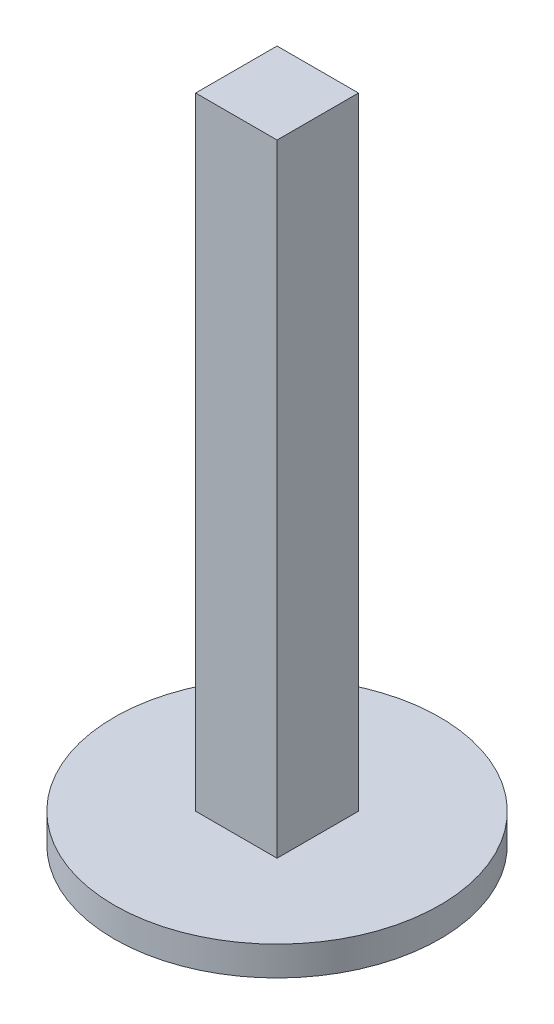
ISO-10303-21;
HEADER;
FILE_DESCRIPTION(('STEP AP214'),'2;1');
FILE_NAME('part.step','',(''),(''),'','','');
FILE_SCHEMA(('AUTOMOTIVE_DESIGN { 1 0 10303 214 1 1 1 1 }'));
ENDSEC;
DATA;
#1=APPLICATION_CONTEXT('core data for automotive mechanical design processes');
#2=APPLICATION_PROTOCOL_DEFINITION('international standard','automotive_design',2000,#1);
#3=PRODUCT_CONTEXT('',#1,'mechanical');
#4=PRODUCT('Part','Part','',(#3));
#5=PRODUCT_RELATED_PRODUCT_CATEGORY('part','',(#4));
#6=PRODUCT_DEFINITION_FORMATION('','',#4);
#7=PRODUCT_DEFINITION_CONTEXT('part definition',#1,'design');
#8=PRODUCT_DEFINITION('design','',#6,#7);
#9=PRODUCT_DEFINITION_SHAPE('','',#8);
#10=(LENGTH_UNIT() NAMED_UNIT(*) SI_UNIT(.MILLI.,.METRE.));
#11=(NAMED_UNIT(*) PLANE_ANGLE_UNIT() SI_UNIT($,.RADIAN.));
#12=(NAMED_UNIT(*) SI_UNIT($,.STERADIAN.) SOLID_ANGLE_UNIT());
#13=UNCERTAINTY_MEASURE_WITH_UNIT(LENGTH_MEASURE(1.E-05),#10,'distance_accuracy_value','');
#14=(GEOMETRIC_REPRESENTATION_CONTEXT(3) GLOBAL_UNCERTAINTY_ASSIGNED_CONTEXT((#13)) GLOBAL_UNIT_ASSIGNED_CONTEXT((#10,
#11,#12)) REPRESENTATION_CONTEXT('',''));
#15=CARTESIAN_POINT('',(0.,0.,0.));
#16=DIRECTION('',(0.,0.,1.));
#17=DIRECTION('',(1.,0.,0.));
#18=AXIS2_PLACEMENT_3D('',#15,#16,#17);
#19=CARTESIAN_POINT('',(0.,2.286,0.));
#20=DIRECTION('',(0.,1.,0.));
#21=DIRECTION('',(0.,0.,1.));
#22=AXIS2_PLACEMENT_3D('',#19,#20,#21);
#23=PLANE('',#22);
#24=CARTESIAN_POINT('',(0.,2.286,0.));
#25=DIRECTION('',(0.,1.,0.));
#26=DIRECTION('',(0.,0.,1.));
#27=AXIS2_PLACEMENT_3D('',#24,#25,#26);
#28=CIRCLE('',#27,12.7);
#29=CARTESIAN_POINT('',(0.,2.286,12.7));
#30=VERTEX_POINT('',#29);
#31=EDGE_CURVE('E11',#30,#30,#28,.T.);
#32=ORIENTED_EDGE('',*,*,#31,.T.);
#33=EDGE_LOOP('',(#32));
#34=FACE_BOUND('',#33,.T.);
#35=DIRECTION('',(-1.,0.,0.));
#36=VECTOR('',#35,1.);
#37=CARTESIAN_POINT('',(0.,2.286,3.175));
#38=LINE('',#37,#36);
#39=CARTESIAN_POINT('',(3.175,2.286,3.175));
#40=VERTEX_POINT('',#39);
#41=CARTESIAN_POINT('',(-3.175,2.286,3.175));
#42=VERTEX_POINT('',#41);
#43=EDGE_CURVE('E55',#40,#42,#38,.T.);
#44=ORIENTED_EDGE('',*,*,#43,.T.);
#45=DIRECTION('',(0.,0.,-1.));
#46=VECTOR('',#45,1.);
#47=CARTESIAN_POINT('',(-3.175,2.286,0.));
#48=LINE('',#47,#46);
#49=CARTESIAN_POINT('',(-3.175,2.286,-3.175));
#50=VERTEX_POINT('',#49);
#51=EDGE_CURVE('E103',#42,#50,#48,.T.);
#52=ORIENTED_EDGE('',*,*,#51,.T.);
#53=DIRECTION('',(-1.,0.,0.));
#54=VECTOR('',#53,1.);
#55=CARTESIAN_POINT('',(0.,2.286,-3.175));
#56=LINE('',#55,#54);
#57=CARTESIAN_POINT('',(3.175,2.286,-3.175));
#58=VERTEX_POINT('',#57);
#59=EDGE_CURVE('E105',#58,#50,#56,.T.);
#60=ORIENTED_EDGE('',*,*,#59,.F.);
#61=DIRECTION('',(0.,0.,-1.));
#62=VECTOR('',#61,1.);
#63=CARTESIAN_POINT('',(3.175,2.286,0.));
#64=LINE('',#63,#62);
#65=EDGE_CURVE('E60',#40,#58,#64,.T.);
#66=ORIENTED_EDGE('',*,*,#65,.F.);
#67=EDGE_LOOP('',(#44,#52,#60,#66));
#68=FACE_BOUND('',#67,.T.);
#69=ADVANCED_FACE('F39',(#34,#68),#23,.T.);
#70=CARTESIAN_POINT('',(0.,2.286,0.));
#71=DIRECTION('',(0.,-1.,0.));
#72=DIRECTION('',(0.,0.,-1.));
#73=AXIS2_PLACEMENT_3D('',#70,#71,#72);
#74=CYLINDRICAL_SURFACE('',#73,12.7);
#75=ORIENTED_EDGE('',*,*,#31,.F.);
#76=EDGE_LOOP('',(#75));
#77=FACE_BOUND('',#76,.T.);
#78=CARTESIAN_POINT('',(0.,0.,0.));
#79=DIRECTION('',(0.,1.,0.));
#80=DIRECTION('',(0.,0.,1.));
#81=AXIS2_PLACEMENT_3D('',#78,#79,#80);
#82=CIRCLE('',#81,12.7);
#83=CARTESIAN_POINT('',(0.,0.,12.7));
#84=VERTEX_POINT('',#83);
#85=EDGE_CURVE('E43',#84,#84,#82,.T.);
#86=ORIENTED_EDGE('',*,*,#85,.T.);
#87=EDGE_LOOP('',(#86));
#88=FACE_BOUND('',#87,.T.);
#89=ADVANCED_FACE('F41',(#77,#88),#74,.T.);
#90=CARTESIAN_POINT('',(0.,0.,0.));
#91=DIRECTION('',(0.,1.,0.));
#92=DIRECTION('',(0.,0.,1.));
#93=AXIS2_PLACEMENT_3D('',#90,#91,#92);
#94=PLANE('',#93);
#95=ORIENTED_EDGE('',*,*,#85,.F.);
#96=EDGE_LOOP('',(#95));
#97=FACE_BOUND('',#96,.T.);
#98=ADVANCED_FACE('F125',(#97),#94,.F.);
#99=CARTESIAN_POINT('',(-3.175,50.8,-3.175));
#100=DIRECTION('',(1.,0.,0.));
#101=DIRECTION('',(0.,0.,-1.));
#102=AXIS2_PLACEMENT_3D('',#99,#100,#101);
#103=PLANE('',#102);
#104=ORIENTED_EDGE('',*,*,#51,.F.);
#105=DIRECTION('',(0.,-1.,0.));
#106=VECTOR('',#105,1.);
#107=CARTESIAN_POINT('',(-3.175,50.8,3.175));
#108=LINE('',#107,#106);
#109=CARTESIAN_POINT('',(-3.175,50.8,3.175));
#110=VERTEX_POINT('',#109);
#111=EDGE_CURVE('E83',#110,#42,#108,.T.);
#112=ORIENTED_EDGE('',*,*,#111,.F.);
#113=DIRECTION('',(0.,0.,1.));
#114=VECTOR('',#113,1.);
#115=CARTESIAN_POINT('',(-3.175,50.8,-3.175));
#116=LINE('',#115,#114);
#117=CARTESIAN_POINT('',(-3.175,50.8,-3.175));
#118=VERTEX_POINT('',#117);
#119=EDGE_CURVE('E91',#118,#110,#116,.T.);
#120=ORIENTED_EDGE('',*,*,#119,.F.);
#121=DIRECTION('',(0.,-1.,0.));
#122=VECTOR('',#121,1.);
#123=CARTESIAN_POINT('',(-3.175,50.8,-3.175));
#124=LINE('',#123,#122);
#125=EDGE_CURVE('E196',#118,#50,#124,.T.);
#126=ORIENTED_EDGE('',*,*,#125,.T.);
#127=EDGE_LOOP('',(#104,#112,#120,#126));
#128=FACE_BOUND('',#127,.T.);
#129=ADVANCED_FACE('F102',(#128),#103,.F.);
#130=CARTESIAN_POINT('',(-3.175,50.8,3.175));
#131=DIRECTION('',(0.,0.,-1.));
#132=DIRECTION('',(-1.,0.,0.));
#133=AXIS2_PLACEMENT_3D('',#130,#131,#132);
#134=PLANE('',#133);
#135=ORIENTED_EDGE('',*,*,#43,.F.);
#136=DIRECTION('',(0.,-1.,0.));
#137=VECTOR('',#136,1.);
#138=CARTESIAN_POINT('',(3.175,50.8,3.175));
#139=LINE('',#138,#137);
#140=CARTESIAN_POINT('',(3.175,50.8,3.175));
#141=VERTEX_POINT('',#140);
#142=EDGE_CURVE('E85',#141,#40,#139,.T.);
#143=ORIENTED_EDGE('',*,*,#142,.F.);
#144=DIRECTION('',(1.,0.,0.));
#145=VECTOR('',#144,1.);
#146=CARTESIAN_POINT('',(-3.175,50.8,3.175));
#147=LINE('',#146,#145);
#148=EDGE_CURVE('E79',#110,#141,#147,.T.);
#149=ORIENTED_EDGE('',*,*,#148,.F.);
#150=ORIENTED_EDGE('',*,*,#111,.T.);
#151=EDGE_LOOP('',(#135,#143,#149,#150));
#152=FACE_BOUND('',#151,.T.);
#153=ADVANCED_FACE('F81',(#152),#134,.F.);
#154=CARTESIAN_POINT('',(3.175,50.8,-3.175));
#155=DIRECTION('',(1.,0.,0.));
#156=DIRECTION('',(0.,0.,-1.));
#157=AXIS2_PLACEMENT_3D('',#154,#155,#156);
#158=PLANE('',#157);
#159=ORIENTED_EDGE('',*,*,#142,.T.);
#160=ORIENTED_EDGE('',*,*,#65,.T.);
#161=DIRECTION('',(0.,-1.,0.));
#162=VECTOR('',#161,1.);
#163=CARTESIAN_POINT('',(3.175,50.8,-3.175));
#164=LINE('',#163,#162);
#165=CARTESIAN_POINT('',(3.175,50.8,-3.175));
#166=VERTEX_POINT('',#165);
#167=EDGE_CURVE('E111',#166,#58,#164,.T.);
#168=ORIENTED_EDGE('',*,*,#167,.F.);
#169=DIRECTION('',(0.,0.,1.));
#170=VECTOR('',#169,1.);
#171=CARTESIAN_POINT('',(3.175,50.8,-3.175));
#172=LINE('',#171,#170);
#173=EDGE_CURVE('E90',#166,#141,#172,.T.);
#174=ORIENTED_EDGE('',*,*,#173,.T.);
#175=EDGE_LOOP('',(#159,#160,#168,#174));
#176=FACE_BOUND('',#175,.T.);
#177=ADVANCED_FACE('F141',(#176),#158,.T.);
#178=CARTESIAN_POINT('',(-3.175,50.8,-3.175));
#179=DIRECTION('',(0.,0.,-1.));
#180=DIRECTION('',(-1.,0.,0.));
#181=AXIS2_PLACEMENT_3D('',#178,#179,#180);
#182=PLANE('',#181);
#183=ORIENTED_EDGE('',*,*,#167,.T.);
#184=ORIENTED_EDGE('',*,*,#59,.T.);
#185=ORIENTED_EDGE('',*,*,#125,.F.);
#186=DIRECTION('',(1.,0.,0.));
#187=VECTOR('',#186,1.);
#188=CARTESIAN_POINT('',(-3.175,50.8,-3.175));
#189=LINE('',#188,#187);
#190=EDGE_CURVE('E97',#118,#166,#189,.T.);
#191=ORIENTED_EDGE('',*,*,#190,.T.);
#192=EDGE_LOOP('',(#183,#184,#185,#191));
#193=FACE_BOUND('',#192,.T.);
#194=ADVANCED_FACE('F144',(#193),#182,.T.);
#195=CARTESIAN_POINT('',(0.,50.8,0.));
#196=DIRECTION('',(0.,1.,0.));
#197=DIRECTION('',(0.,0.,1.));
#198=AXIS2_PLACEMENT_3D('',#195,#196,#197);
#199=PLANE('',#198);
#200=ORIENTED_EDGE('',*,*,#119,.T.);
#201=ORIENTED_EDGE('',*,*,#148,.T.);
#202=ORIENTED_EDGE('',*,*,#173,.F.);
#203=ORIENTED_EDGE('',*,*,#190,.F.);
#204=EDGE_LOOP('',(#200,#201,#202,#203));
#205=FACE_BOUND('',#204,.T.);
#206=ADVANCED_FACE('F95',(#205),#199,.T.);
#207=CLOSED_SHELL('',(#69,#89,#98,#129,#153,#177,#194,#206));
#208=MANIFOLD_SOLID_BREP('B2',#207);
#209=ADVANCED_BREP_SHAPE_REPRESENTATION('',(#18,#208),#14);
#210=SHAPE_DEFINITION_REPRESENTATION(#9,#209);
ENDSEC;
END-ISO-10303-21;
